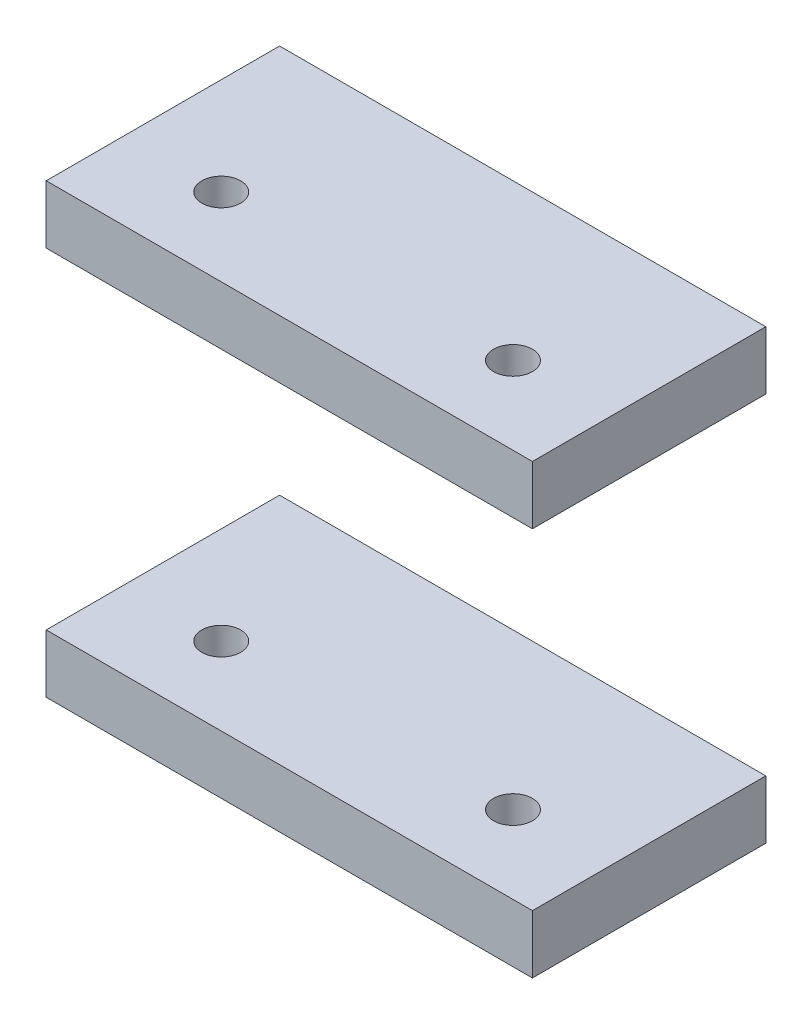
ISO-10303-21;
HEADER;
FILE_DESCRIPTION(('STEP AP214'),'2;1');
FILE_NAME('part.step','',(''),(''),'','','');
FILE_SCHEMA(('AUTOMOTIVE_DESIGN { 1 0 10303 214 1 1 1 1 }'));
ENDSEC;
DATA;
#1=APPLICATION_CONTEXT('core data for automotive mechanical design processes');
#2=APPLICATION_PROTOCOL_DEFINITION('international standard','automotive_design',2000,#1);
#3=PRODUCT_CONTEXT('',#1,'mechanical');
#4=PRODUCT('Part','Part','',(#3));
#5=PRODUCT_RELATED_PRODUCT_CATEGORY('part','',(#4));
#6=PRODUCT_DEFINITION_FORMATION('','',#4);
#7=PRODUCT_DEFINITION_CONTEXT('part definition',#1,'design');
#8=PRODUCT_DEFINITION('design','',#6,#7);
#9=PRODUCT_DEFINITION_SHAPE('','',#8);
#10=(LENGTH_UNIT() NAMED_UNIT(*) SI_UNIT(.MILLI.,.METRE.));
#11=(NAMED_UNIT(*) PLANE_ANGLE_UNIT() SI_UNIT($,.RADIAN.));
#12=(NAMED_UNIT(*) SI_UNIT($,.STERADIAN.) SOLID_ANGLE_UNIT());
#13=UNCERTAINTY_MEASURE_WITH_UNIT(LENGTH_MEASURE(1.E-05),#10,'distance_accuracy_value','');
#14=(GEOMETRIC_REPRESENTATION_CONTEXT(3) GLOBAL_UNCERTAINTY_ASSIGNED_CONTEXT((#13)) GLOBAL_UNIT_ASSIGNED_CONTEXT((#10,
#11,#12)) REPRESENTATION_CONTEXT('',''));
#15=CARTESIAN_POINT('',(0.,0.,0.));
#16=DIRECTION('',(0.,0.,1.));
#17=DIRECTION('',(1.,0.,0.));
#18=AXIS2_PLACEMENT_3D('',#15,#16,#17);
#19=CARTESIAN_POINT('',(-25.,17.,24.));
#20=DIRECTION('',(-1.,0.,0.));
#21=DIRECTION('',(0.,0.,1.));
#22=AXIS2_PLACEMENT_3D('',#19,#20,#21);
#23=PLANE('',#22);
#24=DIRECTION('',(0.,1.,0.));
#25=VECTOR('',#24,1.);
#26=CARTESIAN_POINT('',(-25.,17.,0.));
#27=LINE('',#26,#25);
#28=CARTESIAN_POINT('',(-25.,17.,0.));
#29=VERTEX_POINT('',#28);
#30=CARTESIAN_POINT('',(-25.,23.,0.));
#31=VERTEX_POINT('',#30);
#32=EDGE_CURVE('E12',#29,#31,#27,.T.);
#33=ORIENTED_EDGE('',*,*,#32,.F.);
#34=DIRECTION('',(0.,0.,-1.));
#35=VECTOR('',#34,1.);
#36=CARTESIAN_POINT('',(-25.,17.,24.));
#37=LINE('',#36,#35);
#38=CARTESIAN_POINT('',(-25.,17.,24.));
#39=VERTEX_POINT('',#38);
#40=EDGE_CURVE('E90',#39,#29,#37,.T.);
#41=ORIENTED_EDGE('',*,*,#40,.F.);
#42=DIRECTION('',(0.,1.,0.));
#43=VECTOR('',#42,1.);
#44=CARTESIAN_POINT('',(-25.,17.,24.));
#45=LINE('',#44,#43);
#46=CARTESIAN_POINT('',(-25.,23.,24.));
#47=VERTEX_POINT('',#46);
#48=EDGE_CURVE('E47',#39,#47,#45,.T.);
#49=ORIENTED_EDGE('',*,*,#48,.T.);
#50=DIRECTION('',(0.,0.,-1.));
#51=VECTOR('',#50,1.);
#52=CARTESIAN_POINT('',(-25.,23.,24.));
#53=LINE('',#52,#51);
#54=EDGE_CURVE('E62',#47,#31,#53,.T.);
#55=ORIENTED_EDGE('',*,*,#54,.T.);
#56=EDGE_LOOP('',(#33,#41,#49,#55));
#57=FACE_BOUND('',#56,.T.);
#58=ADVANCED_FACE('F43',(#57),#23,.T.);
#59=CARTESIAN_POINT('',(-25.,17.,24.));
#60=DIRECTION('',(0.,1.,0.));
#61=DIRECTION('',(0.,0.,1.));
#62=AXIS2_PLACEMENT_3D('',#59,#60,#61);
#63=PLANE('',#62);
#64=CARTESIAN_POINT('',(-15.,17.,16.));
#65=DIRECTION('',(0.,1.,0.));
#66=DIRECTION('',(0.,0.,1.));
#67=AXIS2_PLACEMENT_3D('',#64,#65,#66);
#68=CIRCLE('',#67,2.);
#69=CARTESIAN_POINT('',(-15.,17.,18.));
#70=VERTEX_POINT('',#69);
#71=EDGE_CURVE('E174',#70,#70,#68,.T.);
#72=ORIENTED_EDGE('',*,*,#71,.T.);
#73=EDGE_LOOP('',(#72));
#74=FACE_BOUND('',#73,.T.);
#75=CARTESIAN_POINT('',(15.,17.,16.));
#76=DIRECTION('',(0.,1.,0.));
#77=DIRECTION('',(0.,0.,1.));
#78=AXIS2_PLACEMENT_3D('',#75,#76,#77);
#79=CIRCLE('',#78,2.);
#80=CARTESIAN_POINT('',(15.,17.,18.));
#81=VERTEX_POINT('',#80);
#82=EDGE_CURVE('E175',#81,#81,#79,.T.);
#83=ORIENTED_EDGE('',*,*,#82,.T.);
#84=EDGE_LOOP('',(#83));
#85=FACE_BOUND('',#84,.T.);
#86=DIRECTION('',(1.,0.,0.));
#87=VECTOR('',#86,1.);
#88=CARTESIAN_POINT('',(-25.,17.,0.));
#89=LINE('',#88,#87);
#90=CARTESIAN_POINT('',(25.,17.,0.));
#91=VERTEX_POINT('',#90);
#92=EDGE_CURVE('E93',#29,#91,#89,.T.);
#93=ORIENTED_EDGE('',*,*,#92,.T.);
#94=DIRECTION('',(0.,0.,-1.));
#95=VECTOR('',#94,1.);
#96=CARTESIAN_POINT('',(25.,17.,24.));
#97=LINE('',#96,#95);
#98=CARTESIAN_POINT('',(25.,17.,24.));
#99=VERTEX_POINT('',#98);
#100=EDGE_CURVE('E96',#99,#91,#97,.T.);
#101=ORIENTED_EDGE('',*,*,#100,.F.);
#102=DIRECTION('',(1.,0.,0.));
#103=VECTOR('',#102,1.);
#104=CARTESIAN_POINT('',(-25.,17.,24.));
#105=LINE('',#104,#103);
#106=EDGE_CURVE('E112',#39,#99,#105,.T.);
#107=ORIENTED_EDGE('',*,*,#106,.F.);
#108=ORIENTED_EDGE('',*,*,#40,.T.);
#109=EDGE_LOOP('',(#93,#101,#107,#108));
#110=FACE_BOUND('',#109,.T.);
#111=ADVANCED_FACE('F95',(#74,#85,#110),#63,.F.);
#112=CARTESIAN_POINT('',(25.,17.,24.));
#113=DIRECTION('',(-1.,0.,0.));
#114=DIRECTION('',(0.,0.,1.));
#115=AXIS2_PLACEMENT_3D('',#112,#113,#114);
#116=PLANE('',#115);
#117=DIRECTION('',(0.,1.,0.));
#118=VECTOR('',#117,1.);
#119=CARTESIAN_POINT('',(25.,17.,0.));
#120=LINE('',#119,#118);
#121=CARTESIAN_POINT('',(25.,23.,0.));
#122=VERTEX_POINT('',#121);
#123=EDGE_CURVE('E99',#91,#122,#120,.T.);
#124=ORIENTED_EDGE('',*,*,#123,.T.);
#125=DIRECTION('',(0.,0.,-1.));
#126=VECTOR('',#125,1.);
#127=CARTESIAN_POINT('',(25.,23.,24.));
#128=LINE('',#127,#126);
#129=CARTESIAN_POINT('',(25.,23.,24.));
#130=VERTEX_POINT('',#129);
#131=EDGE_CURVE('E104',#130,#122,#128,.T.);
#132=ORIENTED_EDGE('',*,*,#131,.F.);
#133=DIRECTION('',(0.,1.,0.));
#134=VECTOR('',#133,1.);
#135=CARTESIAN_POINT('',(25.,17.,24.));
#136=LINE('',#135,#134);
#137=EDGE_CURVE('E79',#99,#130,#136,.T.);
#138=ORIENTED_EDGE('',*,*,#137,.F.);
#139=ORIENTED_EDGE('',*,*,#100,.T.);
#140=EDGE_LOOP('',(#124,#132,#138,#139));
#141=FACE_BOUND('',#140,.T.);
#142=ADVANCED_FACE('F102',(#141),#116,.F.);
#143=CARTESIAN_POINT('',(25.,23.,24.));
#144=DIRECTION('',(0.,-1.,0.));
#145=DIRECTION('',(0.,0.,-1.));
#146=AXIS2_PLACEMENT_3D('',#143,#144,#145);
#147=PLANE('',#146);
#148=CARTESIAN_POINT('',(-15.,23.,16.));
#149=DIRECTION('',(0.,-1.,0.));
#150=DIRECTION('',(0.,0.,-1.));
#151=AXIS2_PLACEMENT_3D('',#148,#149,#150);
#152=CIRCLE('',#151,2.);
#153=CARTESIAN_POINT('',(-15.,23.,14.));
#154=VERTEX_POINT('',#153);
#155=EDGE_CURVE('E171',#154,#154,#152,.T.);
#156=ORIENTED_EDGE('',*,*,#155,.T.);
#157=EDGE_LOOP('',(#156));
#158=FACE_BOUND('',#157,.T.);
#159=CARTESIAN_POINT('',(15.,23.,16.));
#160=DIRECTION('',(0.,-1.,0.));
#161=DIRECTION('',(0.,0.,-1.));
#162=AXIS2_PLACEMENT_3D('',#159,#160,#161);
#163=CIRCLE('',#162,2.);
#164=CARTESIAN_POINT('',(15.,23.,14.));
#165=VERTEX_POINT('',#164);
#166=EDGE_CURVE('E183',#165,#165,#163,.T.);
#167=ORIENTED_EDGE('',*,*,#166,.T.);
#168=EDGE_LOOP('',(#167));
#169=FACE_BOUND('',#168,.T.);
#170=DIRECTION('',(-1.,0.,0.));
#171=VECTOR('',#170,1.);
#172=CARTESIAN_POINT('',(25.,23.,0.));
#173=LINE('',#172,#171);
#174=EDGE_CURVE('E53',#122,#31,#173,.T.);
#175=ORIENTED_EDGE('',*,*,#174,.T.);
#176=ORIENTED_EDGE('',*,*,#54,.F.);
#177=DIRECTION('',(-1.,0.,0.));
#178=VECTOR('',#177,1.);
#179=CARTESIAN_POINT('',(25.,23.,24.));
#180=LINE('',#179,#178);
#181=EDGE_CURVE('E84',#130,#47,#180,.T.);
#182=ORIENTED_EDGE('',*,*,#181,.F.);
#183=ORIENTED_EDGE('',*,*,#131,.T.);
#184=EDGE_LOOP('',(#175,#176,#182,#183));
#185=FACE_BOUND('',#184,.T.);
#186=ADVANCED_FACE('F115',(#158,#169,#185),#147,.F.);
#187=CARTESIAN_POINT('',(0.,0.,24.));
#188=DIRECTION('',(0.,0.,1.));
#189=DIRECTION('',(1.,0.,0.));
#190=AXIS2_PLACEMENT_3D('',#187,#188,#189);
#191=PLANE('',#190);
#192=ORIENTED_EDGE('',*,*,#48,.F.);
#193=ORIENTED_EDGE('',*,*,#106,.T.);
#194=ORIENTED_EDGE('',*,*,#137,.T.);
#195=ORIENTED_EDGE('',*,*,#181,.T.);
#196=EDGE_LOOP('',(#192,#193,#194,#195));
#197=FACE_BOUND('',#196,.T.);
#198=ADVANCED_FACE('F45',(#197),#191,.T.);
#199=CARTESIAN_POINT('',(0.,0.,0.));
#200=DIRECTION('',(0.,0.,1.));
#201=DIRECTION('',(1.,0.,0.));
#202=AXIS2_PLACEMENT_3D('',#199,#200,#201);
#203=PLANE('',#202);
#204=ORIENTED_EDGE('',*,*,#32,.T.);
#205=ORIENTED_EDGE('',*,*,#174,.F.);
#206=ORIENTED_EDGE('',*,*,#123,.F.);
#207=ORIENTED_EDGE('',*,*,#92,.F.);
#208=EDGE_LOOP('',(#204,#205,#206,#207));
#209=FACE_BOUND('',#208,.T.);
#210=ADVANCED_FACE('F107',(#209),#203,.F.);
#211=CARTESIAN_POINT('',(15.,23.,16.));
#212=DIRECTION('',(0.,-1.,0.));
#213=DIRECTION('',(0.,0.,-1.));
#214=AXIS2_PLACEMENT_3D('',#211,#212,#213);
#215=CYLINDRICAL_SURFACE('',#214,2.);
#216=ORIENTED_EDGE('',*,*,#166,.F.);
#217=EDGE_LOOP('',(#216));
#218=FACE_BOUND('',#217,.T.);
#219=ORIENTED_EDGE('',*,*,#82,.F.);
#220=EDGE_LOOP('',(#219));
#221=FACE_BOUND('',#220,.T.);
#222=ADVANCED_FACE('F120',(#218,#221),#215,.F.);
#223=CARTESIAN_POINT('',(-15.,23.,16.));
#224=DIRECTION('',(0.,-1.,0.));
#225=DIRECTION('',(0.,0.,-1.));
#226=AXIS2_PLACEMENT_3D('',#223,#224,#225);
#227=CYLINDRICAL_SURFACE('',#226,2.);
#228=ORIENTED_EDGE('',*,*,#155,.F.);
#229=EDGE_LOOP('',(#228));
#230=FACE_BOUND('',#229,.T.);
#231=ORIENTED_EDGE('',*,*,#71,.F.);
#232=EDGE_LOOP('',(#231));
#233=FACE_BOUND('',#232,.T.);
#234=ADVANCED_FACE('F155',(#230,#233),#227,.F.);
#235=CLOSED_SHELL('',(#58,#111,#142,#186,#198,#210,#222,#234));
#236=MANIFOLD_SOLID_BREP('B2',#235);
#237=CARTESIAN_POINT('',(-25.,-23.,24.));
#238=DIRECTION('',(-1.,0.,0.));
#239=DIRECTION('',(0.,0.,1.));
#240=AXIS2_PLACEMENT_3D('',#237,#238,#239);
#241=PLANE('',#240);
#242=DIRECTION('',(0.,1.,0.));
#243=VECTOR('',#242,1.);
#244=CARTESIAN_POINT('',(-25.,-23.,0.));
#245=LINE('',#244,#243);
#246=CARTESIAN_POINT('',(-25.,-23.,0.));
#247=VERTEX_POINT('',#246);
#248=CARTESIAN_POINT('',(-25.,-17.,0.));
#249=VERTEX_POINT('',#248);
#250=EDGE_CURVE('E276',#247,#249,#245,.T.);
#251=ORIENTED_EDGE('',*,*,#250,.F.);
#252=DIRECTION('',(0.,0.,-1.));
#253=VECTOR('',#252,1.);
#254=CARTESIAN_POINT('',(-25.,-23.,24.));
#255=LINE('',#254,#253);
#256=CARTESIAN_POINT('',(-25.,-23.,24.));
#257=VERTEX_POINT('',#256);
#258=EDGE_CURVE('E41',#257,#247,#255,.T.);
#259=ORIENTED_EDGE('',*,*,#258,.F.);
#260=DIRECTION('',(0.,1.,0.));
#261=VECTOR('',#260,1.);
#262=CARTESIAN_POINT('',(-25.,-23.,24.));
#263=LINE('',#262,#261);
#264=CARTESIAN_POINT('',(-25.,-17.,24.));
#265=VERTEX_POINT('',#264);
#266=EDGE_CURVE('E269',#257,#265,#263,.T.);
#267=ORIENTED_EDGE('',*,*,#266,.T.);
#268=DIRECTION('',(0.,0.,-1.));
#269=VECTOR('',#268,1.);
#270=CARTESIAN_POINT('',(-25.,-17.,24.));
#271=LINE('',#270,#269);
#272=EDGE_CURVE('E252',#265,#249,#271,.T.);
#273=ORIENTED_EDGE('',*,*,#272,.T.);
#274=EDGE_LOOP('',(#251,#259,#267,#273));
#275=FACE_BOUND('',#274,.T.);
#276=ADVANCED_FACE('F209',(#275),#241,.T.);
#277=CARTESIAN_POINT('',(25.,-23.,24.));
#278=DIRECTION('',(0.,-1.,0.));
#279=DIRECTION('',(0.,0.,-1.));
#280=AXIS2_PLACEMENT_3D('',#277,#278,#279);
#281=PLANE('',#280);
#282=CARTESIAN_POINT('',(-15.,-23.,16.));
#283=DIRECTION('',(0.,-1.,0.));
#284=DIRECTION('',(0.,0.,-1.));
#285=AXIS2_PLACEMENT_3D('',#282,#283,#284);
#286=CIRCLE('',#285,2.);
#287=CARTESIAN_POINT('',(-15.,-23.,14.));
#288=VERTEX_POINT('',#287);
#289=EDGE_CURVE('E287',#288,#288,#286,.T.);
#290=ORIENTED_EDGE('',*,*,#289,.F.);
#291=EDGE_LOOP('',(#290));
#292=FACE_BOUND('',#291,.T.);
#293=CARTESIAN_POINT('',(15.,-23.,16.));
#294=DIRECTION('',(0.,-1.,0.));
#295=DIRECTION('',(0.,0.,-1.));
#296=AXIS2_PLACEMENT_3D('',#293,#294,#295);
#297=CIRCLE('',#296,2.);
#298=CARTESIAN_POINT('',(15.,-23.,14.));
#299=VERTEX_POINT('',#298);
#300=EDGE_CURVE('E292',#299,#299,#297,.T.);
#301=ORIENTED_EDGE('',*,*,#300,.F.);
#302=EDGE_LOOP('',(#301));
#303=FACE_BOUND('',#302,.T.);
#304=DIRECTION('',(-1.,0.,0.));
#305=VECTOR('',#304,1.);
#306=CARTESIAN_POINT('',(25.,-23.,0.));
#307=LINE('',#306,#305);
#308=CARTESIAN_POINT('',(25.,-23.,0.));
#309=VERTEX_POINT('',#308);
#310=EDGE_CURVE('E271',#309,#247,#307,.T.);
#311=ORIENTED_EDGE('',*,*,#310,.F.);
#312=DIRECTION('',(0.,0.,-1.));
#313=VECTOR('',#312,1.);
#314=CARTESIAN_POINT('',(25.,-23.,24.));
#315=LINE('',#314,#313);
#316=CARTESIAN_POINT('',(25.,-23.,24.));
#317=VERTEX_POINT('',#316);
#318=EDGE_CURVE('E218',#317,#309,#315,.T.);
#319=ORIENTED_EDGE('',*,*,#318,.F.);
#320=DIRECTION('',(-1.,0.,0.));
#321=VECTOR('',#320,1.);
#322=CARTESIAN_POINT('',(25.,-23.,24.));
#323=LINE('',#322,#321);
#324=EDGE_CURVE('E261',#317,#257,#323,.T.);
#325=ORIENTED_EDGE('',*,*,#324,.T.);
#326=ORIENTED_EDGE('',*,*,#258,.T.);
#327=EDGE_LOOP('',(#311,#319,#325,#326));
#328=FACE_BOUND('',#327,.T.);
#329=ADVANCED_FACE('F301',(#292,#303,#328),#281,.T.);
#330=CARTESIAN_POINT('',(25.,-23.,24.));
#331=DIRECTION('',(-1.,0.,0.));
#332=DIRECTION('',(0.,0.,1.));
#333=AXIS2_PLACEMENT_3D('',#330,#331,#332);
#334=PLANE('',#333);
#335=DIRECTION('',(0.,1.,0.));
#336=VECTOR('',#335,1.);
#337=CARTESIAN_POINT('',(25.,-23.,0.));
#338=LINE('',#337,#336);
#339=CARTESIAN_POINT('',(25.,-17.,0.));
#340=VERTEX_POINT('',#339);
#341=EDGE_CURVE('E265',#309,#340,#338,.T.);
#342=ORIENTED_EDGE('',*,*,#341,.T.);
#343=DIRECTION('',(0.,0.,-1.));
#344=VECTOR('',#343,1.);
#345=CARTESIAN_POINT('',(25.,-17.,24.));
#346=LINE('',#345,#344);
#347=CARTESIAN_POINT('',(25.,-17.,24.));
#348=VERTEX_POINT('',#347);
#349=EDGE_CURVE('E263',#348,#340,#346,.T.);
#350=ORIENTED_EDGE('',*,*,#349,.F.);
#351=DIRECTION('',(0.,1.,0.));
#352=VECTOR('',#351,1.);
#353=CARTESIAN_POINT('',(25.,-23.,24.));
#354=LINE('',#353,#352);
#355=EDGE_CURVE('E257',#317,#348,#354,.T.);
#356=ORIENTED_EDGE('',*,*,#355,.F.);
#357=ORIENTED_EDGE('',*,*,#318,.T.);
#358=EDGE_LOOP('',(#342,#350,#356,#357));
#359=FACE_BOUND('',#358,.T.);
#360=ADVANCED_FACE('F264',(#359),#334,.F.);
#361=CARTESIAN_POINT('',(-25.,-17.,24.));
#362=DIRECTION('',(0.,1.,0.));
#363=DIRECTION('',(0.,0.,1.));
#364=AXIS2_PLACEMENT_3D('',#361,#362,#363);
#365=PLANE('',#364);
#366=CARTESIAN_POINT('',(-15.,-17.,16.));
#367=DIRECTION('',(0.,1.,0.));
#368=DIRECTION('',(0.,0.,1.));
#369=AXIS2_PLACEMENT_3D('',#366,#367,#368);
#370=CIRCLE('',#369,2.);
#371=CARTESIAN_POINT('',(-15.,-17.,18.));
#372=VERTEX_POINT('',#371);
#373=EDGE_CURVE('E212',#372,#372,#370,.T.);
#374=ORIENTED_EDGE('',*,*,#373,.F.);
#375=EDGE_LOOP('',(#374));
#376=FACE_BOUND('',#375,.T.);
#377=CARTESIAN_POINT('',(15.,-17.,16.));
#378=DIRECTION('',(0.,1.,0.));
#379=DIRECTION('',(0.,0.,1.));
#380=AXIS2_PLACEMENT_3D('',#377,#378,#379);
#381=CIRCLE('',#380,2.);
#382=CARTESIAN_POINT('',(15.,-17.,18.));
#383=VERTEX_POINT('',#382);
#384=EDGE_CURVE('E285',#383,#383,#381,.T.);
#385=ORIENTED_EDGE('',*,*,#384,.F.);
#386=EDGE_LOOP('',(#385));
#387=FACE_BOUND('',#386,.T.);
#388=DIRECTION('',(1.,0.,0.));
#389=VECTOR('',#388,1.);
#390=CARTESIAN_POINT('',(-25.,-17.,0.));
#391=LINE('',#390,#389);
#392=EDGE_CURVE('E279',#249,#340,#391,.T.);
#393=ORIENTED_EDGE('',*,*,#392,.F.);
#394=ORIENTED_EDGE('',*,*,#272,.F.);
#395=DIRECTION('',(1.,0.,0.));
#396=VECTOR('',#395,1.);
#397=CARTESIAN_POINT('',(-25.,-17.,24.));
#398=LINE('',#397,#396);
#399=EDGE_CURVE('E260',#265,#348,#398,.T.);
#400=ORIENTED_EDGE('',*,*,#399,.T.);
#401=ORIENTED_EDGE('',*,*,#349,.T.);
#402=EDGE_LOOP('',(#393,#394,#400,#401));
#403=FACE_BOUND('',#402,.T.);
#404=ADVANCED_FACE('F268',(#376,#387,#403),#365,.T.);
#405=CARTESIAN_POINT('',(0.,0.,24.));
#406=DIRECTION('',(0.,0.,-1.));
#407=DIRECTION('',(-1.,0.,0.));
#408=AXIS2_PLACEMENT_3D('',#405,#406,#407);
#409=PLANE('',#408);
#410=ORIENTED_EDGE('',*,*,#266,.F.);
#411=ORIENTED_EDGE('',*,*,#324,.F.);
#412=ORIENTED_EDGE('',*,*,#355,.T.);
#413=ORIENTED_EDGE('',*,*,#399,.F.);
#414=EDGE_LOOP('',(#410,#411,#412,#413));
#415=FACE_BOUND('',#414,.T.);
#416=ADVANCED_FACE('F259',(#415),#409,.F.);
#417=CARTESIAN_POINT('',(0.,0.,0.));
#418=DIRECTION('',(0.,0.,-1.));
#419=DIRECTION('',(-1.,0.,0.));
#420=AXIS2_PLACEMENT_3D('',#417,#418,#419);
#421=PLANE('',#420);
#422=ORIENTED_EDGE('',*,*,#250,.T.);
#423=ORIENTED_EDGE('',*,*,#392,.T.);
#424=ORIENTED_EDGE('',*,*,#341,.F.);
#425=ORIENTED_EDGE('',*,*,#310,.T.);
#426=EDGE_LOOP('',(#422,#423,#424,#425));
#427=FACE_BOUND('',#426,.T.);
#428=ADVANCED_FACE('F306',(#427),#421,.T.);
#429=CARTESIAN_POINT('',(15.,23.,16.));
#430=DIRECTION('',(0.,-1.,0.));
#431=DIRECTION('',(0.,0.,-1.));
#432=AXIS2_PLACEMENT_3D('',#429,#430,#431);
#433=CYLINDRICAL_SURFACE('',#432,2.);
#434=ORIENTED_EDGE('',*,*,#384,.T.);
#435=EDGE_LOOP('',(#434));
#436=FACE_BOUND('',#435,.T.);
#437=ORIENTED_EDGE('',*,*,#300,.T.);
#438=EDGE_LOOP('',(#437));
#439=FACE_BOUND('',#438,.T.);
#440=ADVANCED_FACE('F299',(#436,#439),#433,.F.);
#441=CARTESIAN_POINT('',(-15.,23.,16.));
#442=DIRECTION('',(0.,-1.,0.));
#443=DIRECTION('',(0.,0.,-1.));
#444=AXIS2_PLACEMENT_3D('',#441,#442,#443);
#445=CYLINDRICAL_SURFACE('',#444,2.);
#446=ORIENTED_EDGE('',*,*,#373,.T.);
#447=EDGE_LOOP('',(#446));
#448=FACE_BOUND('',#447,.T.);
#449=ORIENTED_EDGE('',*,*,#289,.T.);
#450=EDGE_LOOP('',(#449));
#451=FACE_BOUND('',#450,.T.);
#452=ADVANCED_FACE('F348',(#448,#451),#445,.F.);
#453=CLOSED_SHELL('',(#276,#329,#360,#404,#416,#428,#440,#452));
#454=MANIFOLD_SOLID_BREP('B6',#453);
#455=ADVANCED_BREP_SHAPE_REPRESENTATION('',(#18,#236,#454),#14);
#456=SHAPE_DEFINITION_REPRESENTATION(#9,#455);
ENDSEC;
END-ISO-10303-21;
